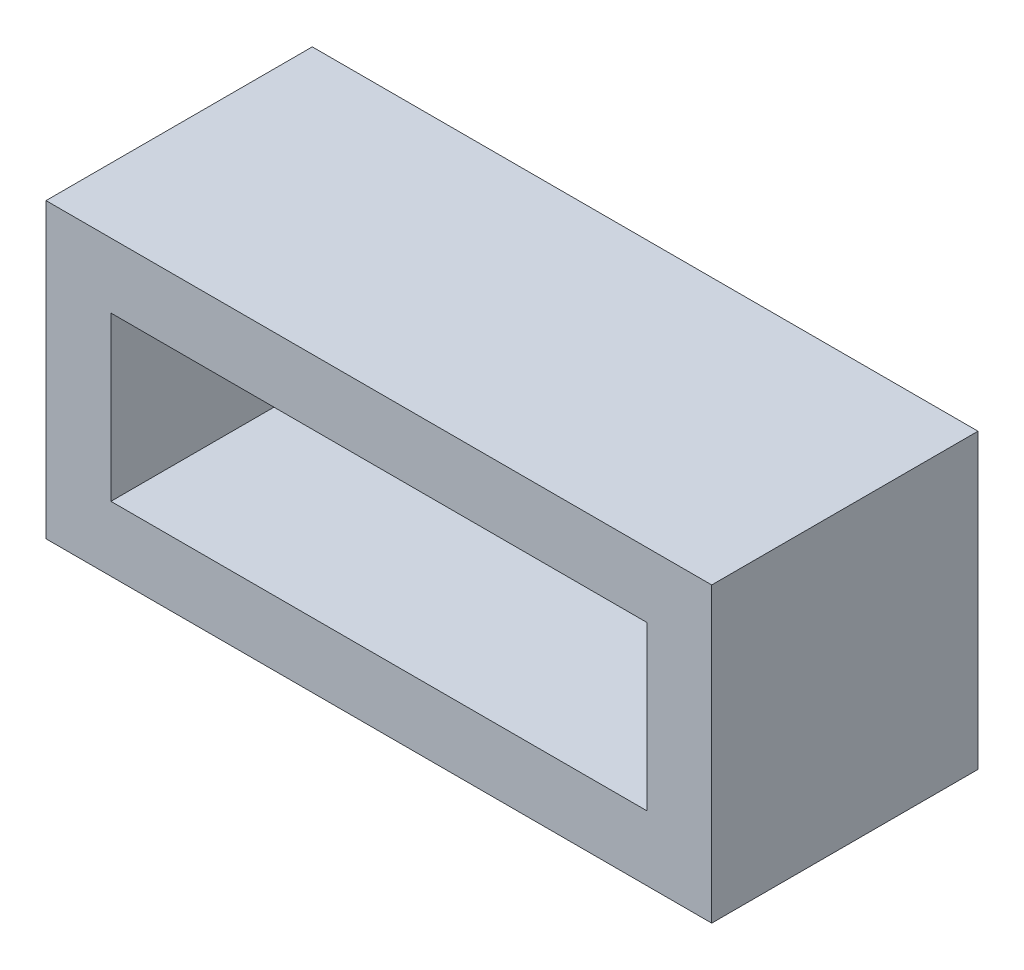
ISO-10303-21;
HEADER;
FILE_DESCRIPTION(('STEP AP214'),'2;1');
FILE_NAME('part.step','',(''),(''),'','','');
FILE_SCHEMA(('AUTOMOTIVE_DESIGN { 1 0 10303 214 1 1 1 1 }'));
ENDSEC;
DATA;
#1=APPLICATION_CONTEXT('core data for automotive mechanical design processes');
#2=APPLICATION_PROTOCOL_DEFINITION('international standard','automotive_design',2000,#1);
#3=PRODUCT_CONTEXT('',#1,'mechanical');
#4=PRODUCT('Part','Part','',(#3));
#5=PRODUCT_RELATED_PRODUCT_CATEGORY('part','',(#4));
#6=PRODUCT_DEFINITION_FORMATION('','',#4);
#7=PRODUCT_DEFINITION_CONTEXT('part definition',#1,'design');
#8=PRODUCT_DEFINITION('design','',#6,#7);
#9=PRODUCT_DEFINITION_SHAPE('','',#8);
#10=(LENGTH_UNIT() NAMED_UNIT(*) SI_UNIT(.MILLI.,.METRE.));
#11=(NAMED_UNIT(*) PLANE_ANGLE_UNIT() SI_UNIT($,.RADIAN.));
#12=(NAMED_UNIT(*) SI_UNIT($,.STERADIAN.) SOLID_ANGLE_UNIT());
#13=UNCERTAINTY_MEASURE_WITH_UNIT(LENGTH_MEASURE(1.E-05),#10,'distance_accuracy_value','');
#14=(GEOMETRIC_REPRESENTATION_CONTEXT(3) GLOBAL_UNCERTAINTY_ASSIGNED_CONTEXT((#13)) GLOBAL_UNIT_ASSIGNED_CONTEXT((#10,
#11,#12)) REPRESENTATION_CONTEXT('',''));
#15=CARTESIAN_POINT('',(0.,0.,0.));
#16=DIRECTION('',(0.,0.,1.));
#17=DIRECTION('',(1.,0.,0.));
#18=AXIS2_PLACEMENT_3D('',#15,#16,#17);
#19=CARTESIAN_POINT('',(0.,0.,10.));
#20=DIRECTION('',(0.,0.,-1.));
#21=DIRECTION('',(-1.,0.,0.));
#22=AXIS2_PLACEMENT_3D('',#19,#20,#21);
#23=PLANE('',#22);
#24=DIRECTION('',(0.,1.,0.));
#25=VECTOR('',#24,1.);
#26=CARTESIAN_POINT('',(12.5,-5.5,10.));
#27=LINE('',#26,#25);
#28=CARTESIAN_POINT('',(12.5,-5.5,10.));
#29=VERTEX_POINT('',#28);
#30=CARTESIAN_POINT('',(12.5,5.5,10.));
#31=VERTEX_POINT('',#30);
#32=EDGE_CURVE('E140',#29,#31,#27,.T.);
#33=ORIENTED_EDGE('',*,*,#32,.T.);
#34=DIRECTION('',(-1.,0.,0.));
#35=VECTOR('',#34,1.);
#36=CARTESIAN_POINT('',(-12.5,5.5,10.));
#37=LINE('',#36,#35);
#38=CARTESIAN_POINT('',(-12.5,5.5,10.));
#39=VERTEX_POINT('',#38);
#40=EDGE_CURVE('E143',#31,#39,#37,.T.);
#41=ORIENTED_EDGE('',*,*,#40,.T.);
#42=DIRECTION('',(0.,-1.,0.));
#43=VECTOR('',#42,1.);
#44=CARTESIAN_POINT('',(-12.5,-5.5,10.));
#45=LINE('',#44,#43);
#46=CARTESIAN_POINT('',(-12.5,-5.5,10.));
#47=VERTEX_POINT('',#46);
#48=EDGE_CURVE('E146',#39,#47,#45,.T.);
#49=ORIENTED_EDGE('',*,*,#48,.T.);
#50=DIRECTION('',(1.,0.,0.));
#51=VECTOR('',#50,1.);
#52=CARTESIAN_POINT('',(-12.5,-5.5,10.));
#53=LINE('',#52,#51);
#54=EDGE_CURVE('E148',#47,#29,#53,.T.);
#55=ORIENTED_EDGE('',*,*,#54,.T.);
#56=EDGE_LOOP('',(#33,#41,#49,#55));
#57=FACE_BOUND('',#56,.T.);
#58=DIRECTION('',(0.,1.,0.));
#59=VECTOR('',#58,1.);
#60=CARTESIAN_POINT('',(10.0625,-3.0625,10.));
#61=LINE('',#60,#59);
#62=CARTESIAN_POINT('',(10.0625,-3.0625,10.));
#63=VERTEX_POINT('',#62);
#64=CARTESIAN_POINT('',(10.0625,3.0625,10.));
#65=VERTEX_POINT('',#64);
#66=EDGE_CURVE('E104',#63,#65,#61,.T.);
#67=ORIENTED_EDGE('',*,*,#66,.F.);
#68=DIRECTION('',(1.,0.,0.));
#69=VECTOR('',#68,1.);
#70=CARTESIAN_POINT('',(-10.0625,-3.0625,10.));
#71=LINE('',#70,#69);
#72=CARTESIAN_POINT('',(-10.0625,-3.0625,10.));
#73=VERTEX_POINT('',#72);
#74=EDGE_CURVE('E126',#73,#63,#71,.T.);
#75=ORIENTED_EDGE('',*,*,#74,.F.);
#76=DIRECTION('',(0.,-1.,0.));
#77=VECTOR('',#76,1.);
#78=CARTESIAN_POINT('',(-10.0625,-3.0625,10.));
#79=LINE('',#78,#77);
#80=CARTESIAN_POINT('',(-10.0625,3.0625,10.));
#81=VERTEX_POINT('',#80);
#82=EDGE_CURVE('E124',#81,#73,#79,.T.);
#83=ORIENTED_EDGE('',*,*,#82,.F.);
#84=DIRECTION('',(-1.,0.,0.));
#85=VECTOR('',#84,1.);
#86=CARTESIAN_POINT('',(-10.0625,3.0625,10.));
#87=LINE('',#86,#85);
#88=EDGE_CURVE('E112',#65,#81,#87,.T.);
#89=ORIENTED_EDGE('',*,*,#88,.F.);
#90=EDGE_LOOP('',(#67,#75,#83,#89));
#91=FACE_BOUND('',#90,.T.);
#92=ADVANCED_FACE('F39',(#57,#91),#23,.F.);
#93=CARTESIAN_POINT('',(0.,0.,0.));
#94=DIRECTION('',(0.,0.,-1.));
#95=DIRECTION('',(-1.,0.,0.));
#96=AXIS2_PLACEMENT_3D('',#93,#94,#95);
#97=PLANE('',#96);
#98=DIRECTION('',(0.,1.,0.));
#99=VECTOR('',#98,1.);
#100=CARTESIAN_POINT('',(12.5,-5.5,0.));
#101=LINE('',#100,#99);
#102=CARTESIAN_POINT('',(12.5,-5.5,0.));
#103=VERTEX_POINT('',#102);
#104=CARTESIAN_POINT('',(12.5,5.5,0.));
#105=VERTEX_POINT('',#104);
#106=EDGE_CURVE('E120',#103,#105,#101,.T.);
#107=ORIENTED_EDGE('',*,*,#106,.F.);
#108=DIRECTION('',(1.,0.,0.));
#109=VECTOR('',#108,1.);
#110=CARTESIAN_POINT('',(-12.5,-5.5,0.));
#111=LINE('',#110,#109);
#112=CARTESIAN_POINT('',(-12.5,-5.5,0.));
#113=VERTEX_POINT('',#112);
#114=EDGE_CURVE('E144',#113,#103,#111,.T.);
#115=ORIENTED_EDGE('',*,*,#114,.F.);
#116=DIRECTION('',(0.,-1.,0.));
#117=VECTOR('',#116,1.);
#118=CARTESIAN_POINT('',(-12.5,-5.5,0.));
#119=LINE('',#118,#117);
#120=CARTESIAN_POINT('',(-12.5,5.5,0.));
#121=VERTEX_POINT('',#120);
#122=EDGE_CURVE('E155',#121,#113,#119,.T.);
#123=ORIENTED_EDGE('',*,*,#122,.F.);
#124=DIRECTION('',(-1.,0.,0.));
#125=VECTOR('',#124,1.);
#126=CARTESIAN_POINT('',(-12.5,5.5,0.));
#127=LINE('',#126,#125);
#128=EDGE_CURVE('E153',#105,#121,#127,.T.);
#129=ORIENTED_EDGE('',*,*,#128,.F.);
#130=EDGE_LOOP('',(#107,#115,#123,#129));
#131=FACE_BOUND('',#130,.T.);
#132=DIRECTION('',(1.,0.,0.));
#133=VECTOR('',#132,1.);
#134=CARTESIAN_POINT('',(-10.0625,-3.0625,0.));
#135=LINE('',#134,#133);
#136=CARTESIAN_POINT('',(-10.0625,-3.0625,0.));
#137=VERTEX_POINT('',#136);
#138=CARTESIAN_POINT('',(10.0625,-3.0625,0.));
#139=VERTEX_POINT('',#138);
#140=EDGE_CURVE('E113',#137,#139,#135,.T.);
#141=ORIENTED_EDGE('',*,*,#140,.T.);
#142=DIRECTION('',(0.,1.,0.));
#143=VECTOR('',#142,1.);
#144=CARTESIAN_POINT('',(10.0625,-3.0625,0.));
#145=LINE('',#144,#143);
#146=CARTESIAN_POINT('',(10.0625,3.0625,0.));
#147=VERTEX_POINT('',#146);
#148=EDGE_CURVE('E62',#139,#147,#145,.T.);
#149=ORIENTED_EDGE('',*,*,#148,.T.);
#150=DIRECTION('',(-1.,0.,0.));
#151=VECTOR('',#150,1.);
#152=CARTESIAN_POINT('',(-10.0625,3.0625,0.));
#153=LINE('',#152,#151);
#154=CARTESIAN_POINT('',(-10.0625,3.0625,0.));
#155=VERTEX_POINT('',#154);
#156=EDGE_CURVE('E119',#147,#155,#153,.T.);
#157=ORIENTED_EDGE('',*,*,#156,.T.);
#158=DIRECTION('',(0.,-1.,0.));
#159=VECTOR('',#158,1.);
#160=CARTESIAN_POINT('',(-10.0625,-3.0625,0.));
#161=LINE('',#160,#159);
#162=EDGE_CURVE('E132',#155,#137,#161,.T.);
#163=ORIENTED_EDGE('',*,*,#162,.T.);
#164=EDGE_LOOP('',(#141,#149,#157,#163));
#165=FACE_BOUND('',#164,.T.);
#166=ADVANCED_FACE('F173',(#131,#165),#97,.T.);
#167=CARTESIAN_POINT('',(12.5,-5.5,10.));
#168=DIRECTION('',(-1.,0.,0.));
#169=DIRECTION('',(0.,0.,1.));
#170=AXIS2_PLACEMENT_3D('',#167,#168,#169);
#171=PLANE('',#170);
#172=ORIENTED_EDGE('',*,*,#106,.T.);
#173=DIRECTION('',(0.,0.,-1.));
#174=VECTOR('',#173,1.);
#175=CARTESIAN_POINT('',(12.5,5.5,10.));
#176=LINE('',#175,#174);
#177=EDGE_CURVE('E11',#31,#105,#176,.T.);
#178=ORIENTED_EDGE('',*,*,#177,.F.);
#179=ORIENTED_EDGE('',*,*,#32,.F.);
#180=DIRECTION('',(0.,0.,-1.));
#181=VECTOR('',#180,1.);
#182=CARTESIAN_POINT('',(12.5,-5.5,10.));
#183=LINE('',#182,#181);
#184=EDGE_CURVE('E150',#29,#103,#183,.T.);
#185=ORIENTED_EDGE('',*,*,#184,.T.);
#186=EDGE_LOOP('',(#172,#178,#179,#185));
#187=FACE_BOUND('',#186,.T.);
#188=ADVANCED_FACE('F41',(#187),#171,.F.);
#189=CARTESIAN_POINT('',(-12.5,5.5,10.));
#190=DIRECTION('',(0.,-1.,0.));
#191=DIRECTION('',(0.,0.,-1.));
#192=AXIS2_PLACEMENT_3D('',#189,#190,#191);
#193=PLANE('',#192);
#194=ORIENTED_EDGE('',*,*,#128,.T.);
#195=DIRECTION('',(0.,0.,-1.));
#196=VECTOR('',#195,1.);
#197=CARTESIAN_POINT('',(-12.5,5.5,10.));
#198=LINE('',#197,#196);
#199=EDGE_CURVE('E47',#39,#121,#198,.T.);
#200=ORIENTED_EDGE('',*,*,#199,.F.);
#201=ORIENTED_EDGE('',*,*,#40,.F.);
#202=ORIENTED_EDGE('',*,*,#177,.T.);
#203=EDGE_LOOP('',(#194,#200,#201,#202));
#204=FACE_BOUND('',#203,.T.);
#205=ADVANCED_FACE('F183',(#204),#193,.F.);
#206=CARTESIAN_POINT('',(-12.5,-5.5,10.));
#207=DIRECTION('',(1.,0.,0.));
#208=DIRECTION('',(0.,0.,-1.));
#209=AXIS2_PLACEMENT_3D('',#206,#207,#208);
#210=PLANE('',#209);
#211=ORIENTED_EDGE('',*,*,#122,.T.);
#212=DIRECTION('',(0.,0.,-1.));
#213=VECTOR('',#212,1.);
#214=CARTESIAN_POINT('',(-12.5,-5.5,10.));
#215=LINE('',#214,#213);
#216=EDGE_CURVE('E160',#47,#113,#215,.T.);
#217=ORIENTED_EDGE('',*,*,#216,.F.);
#218=ORIENTED_EDGE('',*,*,#48,.F.);
#219=ORIENTED_EDGE('',*,*,#199,.T.);
#220=EDGE_LOOP('',(#211,#217,#218,#219));
#221=FACE_BOUND('',#220,.T.);
#222=ADVANCED_FACE('F167',(#221),#210,.F.);
#223=CARTESIAN_POINT('',(-12.5,-5.5,10.));
#224=DIRECTION('',(0.,1.,0.));
#225=DIRECTION('',(0.,0.,1.));
#226=AXIS2_PLACEMENT_3D('',#223,#224,#225);
#227=PLANE('',#226);
#228=ORIENTED_EDGE('',*,*,#114,.T.);
#229=ORIENTED_EDGE('',*,*,#184,.F.);
#230=ORIENTED_EDGE('',*,*,#54,.F.);
#231=ORIENTED_EDGE('',*,*,#216,.T.);
#232=EDGE_LOOP('',(#228,#229,#230,#231));
#233=FACE_BOUND('',#232,.T.);
#234=ADVANCED_FACE('F177',(#233),#227,.F.);
#235=CARTESIAN_POINT('',(10.0625,-3.0625,10.));
#236=DIRECTION('',(-1.,0.,0.));
#237=DIRECTION('',(0.,0.,1.));
#238=AXIS2_PLACEMENT_3D('',#235,#236,#237);
#239=PLANE('',#238);
#240=ORIENTED_EDGE('',*,*,#148,.F.);
#241=DIRECTION('',(0.,0.,-1.));
#242=VECTOR('',#241,1.);
#243=CARTESIAN_POINT('',(10.0625,-3.0625,10.));
#244=LINE('',#243,#242);
#245=EDGE_CURVE('E108',#63,#139,#244,.T.);
#246=ORIENTED_EDGE('',*,*,#245,.F.);
#247=ORIENTED_EDGE('',*,*,#66,.T.);
#248=DIRECTION('',(0.,0.,-1.));
#249=VECTOR('',#248,1.);
#250=CARTESIAN_POINT('',(10.0625,3.0625,10.));
#251=LINE('',#250,#249);
#252=EDGE_CURVE('E107',#65,#147,#251,.T.);
#253=ORIENTED_EDGE('',*,*,#252,.T.);
#254=EDGE_LOOP('',(#240,#246,#247,#253));
#255=FACE_BOUND('',#254,.T.);
#256=ADVANCED_FACE('F106',(#255),#239,.T.);
#257=CARTESIAN_POINT('',(-10.0625,3.0625,10.));
#258=DIRECTION('',(0.,-1.,0.));
#259=DIRECTION('',(0.,0.,-1.));
#260=AXIS2_PLACEMENT_3D('',#257,#258,#259);
#261=PLANE('',#260);
#262=ORIENTED_EDGE('',*,*,#156,.F.);
#263=ORIENTED_EDGE('',*,*,#252,.F.);
#264=ORIENTED_EDGE('',*,*,#88,.T.);
#265=DIRECTION('',(0.,0.,-1.));
#266=VECTOR('',#265,1.);
#267=CARTESIAN_POINT('',(-10.0625,3.0625,10.));
#268=LINE('',#267,#266);
#269=EDGE_CURVE('E121',#81,#155,#268,.T.);
#270=ORIENTED_EDGE('',*,*,#269,.T.);
#271=EDGE_LOOP('',(#262,#263,#264,#270));
#272=FACE_BOUND('',#271,.T.);
#273=ADVANCED_FACE('F116',(#272),#261,.T.);
#274=CARTESIAN_POINT('',(-10.0625,-3.0625,10.));
#275=DIRECTION('',(1.,0.,0.));
#276=DIRECTION('',(0.,0.,-1.));
#277=AXIS2_PLACEMENT_3D('',#274,#275,#276);
#278=PLANE('',#277);
#279=ORIENTED_EDGE('',*,*,#162,.F.);
#280=ORIENTED_EDGE('',*,*,#269,.F.);
#281=ORIENTED_EDGE('',*,*,#82,.T.);
#282=DIRECTION('',(0.,0.,-1.));
#283=VECTOR('',#282,1.);
#284=CARTESIAN_POINT('',(-10.0625,-3.0625,10.));
#285=LINE('',#284,#283);
#286=EDGE_CURVE('E54',#73,#137,#285,.T.);
#287=ORIENTED_EDGE('',*,*,#286,.T.);
#288=EDGE_LOOP('',(#279,#280,#281,#287));
#289=FACE_BOUND('',#288,.T.);
#290=ADVANCED_FACE('F206',(#289),#278,.T.);
#291=CARTESIAN_POINT('',(-10.0625,-3.0625,10.));
#292=DIRECTION('',(0.,1.,0.));
#293=DIRECTION('',(0.,0.,1.));
#294=AXIS2_PLACEMENT_3D('',#291,#292,#293);
#295=PLANE('',#294);
#296=ORIENTED_EDGE('',*,*,#140,.F.);
#297=ORIENTED_EDGE('',*,*,#286,.F.);
#298=ORIENTED_EDGE('',*,*,#74,.T.);
#299=ORIENTED_EDGE('',*,*,#245,.T.);
#300=EDGE_LOOP('',(#296,#297,#298,#299));
#301=FACE_BOUND('',#300,.T.);
#302=ADVANCED_FACE('F210',(#301),#295,.T.);
#303=CLOSED_SHELL('',(#92,#166,#188,#205,#222,#234,#256,#273,#290,#302));
#304=MANIFOLD_SOLID_BREP('B2',#303);
#305=ADVANCED_BREP_SHAPE_REPRESENTATION('',(#18,#304),#14);
#306=SHAPE_DEFINITION_REPRESENTATION(#9,#305);
ENDSEC;
END-ISO-10303-21;
